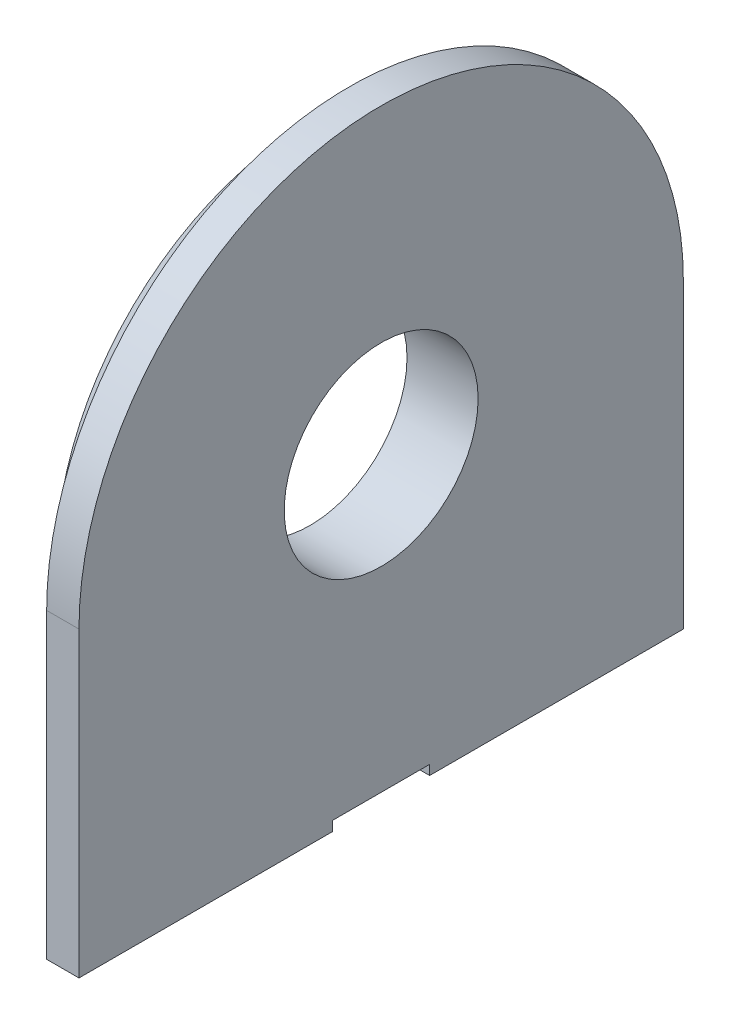
ISO-10303-21;
HEADER;
FILE_DESCRIPTION(('STEP AP214'),'2;1');
FILE_NAME('part.step','',(''),(''),'','','');
FILE_SCHEMA(('AUTOMOTIVE_DESIGN { 1 0 10303 214 1 1 1 1 }'));
ENDSEC;
DATA;
#1=APPLICATION_CONTEXT('core data for automotive mechanical design processes');
#2=APPLICATION_PROTOCOL_DEFINITION('international standard','automotive_design',2000,#1);
#3=PRODUCT_CONTEXT('',#1,'mechanical');
#4=PRODUCT('Part','Part','',(#3));
#5=PRODUCT_RELATED_PRODUCT_CATEGORY('part','',(#4));
#6=PRODUCT_DEFINITION_FORMATION('','',#4);
#7=PRODUCT_DEFINITION_CONTEXT('part definition',#1,'design');
#8=PRODUCT_DEFINITION('design','',#6,#7);
#9=PRODUCT_DEFINITION_SHAPE('','',#8);
#10=(LENGTH_UNIT() NAMED_UNIT(*) SI_UNIT(.MILLI.,.METRE.));
#11=(NAMED_UNIT(*) PLANE_ANGLE_UNIT() SI_UNIT($,.RADIAN.));
#12=(NAMED_UNIT(*) SI_UNIT($,.STERADIAN.) SOLID_ANGLE_UNIT());
#13=UNCERTAINTY_MEASURE_WITH_UNIT(LENGTH_MEASURE(1.E-05),#10,'distance_accuracy_value','');
#14=(GEOMETRIC_REPRESENTATION_CONTEXT(3) GLOBAL_UNCERTAINTY_ASSIGNED_CONTEXT((#13)) GLOBAL_UNIT_ASSIGNED_CONTEXT((#10,
#11,#12)) REPRESENTATION_CONTEXT('',''));
#15=CARTESIAN_POINT('',(0.,0.,0.));
#16=DIRECTION('',(0.,0.,1.));
#17=DIRECTION('',(1.,0.,0.));
#18=AXIS2_PLACEMENT_3D('',#15,#16,#17);
#19=CARTESIAN_POINT('',(17.3,0.,0.));
#20=DIRECTION('',(1.,0.,0.));
#21=DIRECTION('',(0.,0.,-1.));
#22=AXIS2_PLACEMENT_3D('',#19,#20,#21);
#23=CYLINDRICAL_SURFACE('',#22,8.35);
#24=DIRECTION('',(1.,0.,0.));
#25=VECTOR('',#24,1.);
#26=CARTESIAN_POINT('',(17.3,-8.24818161778704,-1.3));
#27=LINE('',#26,#25);
#28=CARTESIAN_POINT('',(17.8,-8.24818161778704,-1.3));
#29=VERTEX_POINT('',#28);
#30=CARTESIAN_POINT('',(18.5,-8.24818161778704,-1.3));
#31=VERTEX_POINT('',#30);
#32=EDGE_CURVE('E195',#29,#31,#27,.T.);
#33=ORIENTED_EDGE('',*,*,#32,.F.);
#34=CARTESIAN_POINT('',(17.8,0.,0.));
#35=DIRECTION('',(1.,0.,0.));
#36=DIRECTION('',(0.,0.,-1.));
#37=AXIS2_PLACEMENT_3D('',#34,#35,#36);
#38=CIRCLE('',#37,8.35);
#39=CARTESIAN_POINT('',(17.8,-8.24818161778704,1.30000000000001));
#40=VERTEX_POINT('',#39);
#41=EDGE_CURVE('E194',#29,#40,#38,.T.);
#42=ORIENTED_EDGE('',*,*,#41,.T.);
#43=DIRECTION('',(1.,0.,0.));
#44=VECTOR('',#43,1.);
#45=CARTESIAN_POINT('',(17.3,-8.24818161778704,1.30000000000001));
#46=LINE('',#45,#44);
#47=CARTESIAN_POINT('',(18.5,-8.24818161778704,1.30000000000001));
#48=VERTEX_POINT('',#47);
#49=EDGE_CURVE('E192',#40,#48,#46,.T.);
#50=ORIENTED_EDGE('',*,*,#49,.T.);
#51=CARTESIAN_POINT('',(18.5,0.,0.));
#52=DIRECTION('',(1.,0.,0.));
#53=DIRECTION('',(0.,0.,-1.));
#54=AXIS2_PLACEMENT_3D('',#51,#52,#53);
#55=CIRCLE('',#54,8.35);
#56=EDGE_CURVE('E180',#31,#48,#55,.T.);
#57=ORIENTED_EDGE('',*,*,#56,.F.);
#58=EDGE_LOOP('',(#33,#42,#50,#57));
#59=FACE_BOUND('',#58,.T.);
#60=ADVANCED_FACE('F42',(#59),#23,.T.);
#61=CARTESIAN_POINT('',(17.3,-8.41739270795892,-1.3));
#62=DIRECTION('',(0.,0.,-1.));
#63=DIRECTION('',(-1.,0.,0.));
#64=AXIS2_PLACEMENT_3D('',#61,#62,#63);
#65=PLANE('',#64);
#66=DIRECTION('',(0.,1.,0.));
#67=VECTOR('',#66,1.);
#68=CARTESIAN_POINT('',(18.5,-8.41739270795892,-1.3));
#69=LINE('',#68,#67);
#70=CARTESIAN_POINT('',(18.5,-9.05,-1.3));
#71=VERTEX_POINT('',#70);
#72=EDGE_CURVE('E187',#71,#31,#69,.T.);
#73=ORIENTED_EDGE('',*,*,#72,.F.);
#74=DIRECTION('',(1.,0.,0.));
#75=VECTOR('',#74,1.);
#76=CARTESIAN_POINT('',(17.3,-9.05,-1.3));
#77=LINE('',#76,#75);
#78=CARTESIAN_POINT('',(17.3,-9.05,-1.3));
#79=VERTEX_POINT('',#78);
#80=EDGE_CURVE('E198',#79,#71,#77,.T.);
#81=ORIENTED_EDGE('',*,*,#80,.F.);
#82=DIRECTION('',(0.,1.,0.));
#83=VECTOR('',#82,1.);
#84=CARTESIAN_POINT('',(17.3,-9.05,-1.3));
#85=LINE('',#84,#83);
#86=CARTESIAN_POINT('',(17.3,-7.74160836002442,-1.3));
#87=VERTEX_POINT('',#86);
#88=EDGE_CURVE('E71',#79,#87,#85,.T.);
#89=ORIENTED_EDGE('',*,*,#88,.T.);
#90=CARTESIAN_POINT('',(17.3,-7.74160836002442,-1.3));
#91=CARTESIAN_POINT('',(17.3832988536166,-7.82607126884317,-1.3));
#92=CARTESIAN_POINT('',(17.4666149471451,-7.91051716145374,-1.3));
#93=CARTESIAN_POINT('',(17.6332816138119,-8.07937491404119,-1.3));
#94=CARTESIAN_POINT('',(17.71663218695,-8.16378677401817,-1.3));
#95=CARTESIAN_POINT('',(17.8,-8.24818161778704,-1.3));
#96=B_SPLINE_CURVE_WITH_KNOTS('',3,(#90,#91,#92,#93,#94,#95),.UNSPECIFIED.,.F.,.F.,(4,2,4),(0.,
0.35588498419705,0.71176996747812),.UNSPECIFIED.);
#97=EDGE_CURVE('E11',#87,#29,#96,.T.);
#98=ORIENTED_EDGE('',*,*,#97,.T.);
#99=ORIENTED_EDGE('',*,*,#32,.T.);
#100=EDGE_LOOP('',(#73,#81,#89,#98,#99));
#101=FACE_BOUND('',#100,.T.);
#102=ADVANCED_FACE('F217',(#101),#65,.T.);
#103=CARTESIAN_POINT('',(17.3,-9.05,-1.3));
#104=DIRECTION('',(0.,-1.,0.));
#105=DIRECTION('',(0.,0.,-1.));
#106=AXIS2_PLACEMENT_3D('',#103,#104,#105);
#107=PLANE('',#106);
#108=ORIENTED_EDGE('',*,*,#80,.T.);
#109=DIRECTION('',(0.,0.,-1.));
#110=VECTOR('',#109,1.);
#111=CARTESIAN_POINT('',(18.5,-9.05,-1.5));
#112=LINE('',#111,#110);
#113=CARTESIAN_POINT('',(18.5,-9.05,-1.5));
#114=VERTEX_POINT('',#113);
#115=EDGE_CURVE('E413',#71,#114,#112,.T.);
#116=ORIENTED_EDGE('',*,*,#115,.T.);
#117=DIRECTION('',(-1.,0.,0.));
#118=VECTOR('',#117,1.);
#119=CARTESIAN_POINT('',(19.5,-9.05,-1.5));
#120=LINE('',#119,#118);
#121=CARTESIAN_POINT('',(19.5,-9.05,-1.5));
#122=VERTEX_POINT('',#121);
#123=EDGE_CURVE('E174',#122,#114,#120,.T.);
#124=ORIENTED_EDGE('',*,*,#123,.F.);
#125=DIRECTION('',(0.,0.,-1.));
#126=VECTOR('',#125,1.);
#127=CARTESIAN_POINT('',(19.5,-9.05,-1.5));
#128=LINE('',#127,#126);
#129=CARTESIAN_POINT('',(19.5,-9.05,1.5));
#130=VERTEX_POINT('',#129);
#131=EDGE_CURVE('E153',#130,#122,#128,.T.);
#132=ORIENTED_EDGE('',*,*,#131,.F.);
#133=DIRECTION('',(-1.,0.,0.));
#134=VECTOR('',#133,1.);
#135=CARTESIAN_POINT('',(19.5,-9.05,1.5));
#136=LINE('',#135,#134);
#137=CARTESIAN_POINT('',(18.5,-9.05,1.5));
#138=VERTEX_POINT('',#137);
#139=EDGE_CURVE('E150',#130,#138,#136,.T.);
#140=ORIENTED_EDGE('',*,*,#139,.T.);
#141=CARTESIAN_POINT('',(18.5,-9.05,1.3));
#142=VERTEX_POINT('',#141);
#143=EDGE_CURVE('E417',#138,#142,#112,.T.);
#144=ORIENTED_EDGE('',*,*,#143,.T.);
#145=DIRECTION('',(1.,0.,0.));
#146=VECTOR('',#145,1.);
#147=CARTESIAN_POINT('',(17.3,-9.05,1.3));
#148=LINE('',#147,#146);
#149=CARTESIAN_POINT('',(17.3,-9.05,1.3));
#150=VERTEX_POINT('',#149);
#151=EDGE_CURVE('E184',#150,#142,#148,.T.);
#152=ORIENTED_EDGE('',*,*,#151,.F.);
#153=DIRECTION('',(0.,0.,-1.));
#154=VECTOR('',#153,1.);
#155=CARTESIAN_POINT('',(17.3,-9.05,-1.3));
#156=LINE('',#155,#154);
#157=EDGE_CURVE('E179',#150,#79,#156,.T.);
#158=ORIENTED_EDGE('',*,*,#157,.T.);
#159=EDGE_LOOP('',(#108,#116,#124,#132,#140,#144,#152,#158));
#160=FACE_BOUND('',#159,.T.);
#161=ADVANCED_FACE('F214',(#160),#107,.T.);
#162=CARTESIAN_POINT('',(17.3,-8.41739270795892,1.3));
#163=DIRECTION('',(0.,0.,1.));
#164=DIRECTION('',(1.,0.,0.));
#165=AXIS2_PLACEMENT_3D('',#162,#163,#164);
#166=PLANE('',#165);
#167=DIRECTION('',(0.,-1.,0.));
#168=VECTOR('',#167,1.);
#169=CARTESIAN_POINT('',(18.5,-8.41739270795892,1.3));
#170=LINE('',#169,#168);
#171=EDGE_CURVE('E172',#48,#142,#170,.T.);
#172=ORIENTED_EDGE('',*,*,#171,.F.);
#173=ORIENTED_EDGE('',*,*,#49,.F.);
#174=CARTESIAN_POINT('',(17.8,-8.24818161778704,1.30000000000001));
#175=CARTESIAN_POINT('',(17.71663218695,-8.16378677401817,1.3));
#176=CARTESIAN_POINT('',(17.6332816138119,-8.07937491404119,1.3));
#177=CARTESIAN_POINT('',(17.4666149471451,-7.91051716145374,1.3));
#178=CARTESIAN_POINT('',(17.3832988536166,-7.82607126884317,1.3));
#179=CARTESIAN_POINT('',(17.3,-7.74160836002442,1.3));
#180=B_SPLINE_CURVE_WITH_KNOTS('',3,(#174,#175,#176,#177,#178,#179),.UNSPECIFIED.,.F.,.F.,(4,2,
4),(0.,0.355884983281069,0.71176996747812),.UNSPECIFIED.);
#181=CARTESIAN_POINT('',(17.3,-7.74160836002442,1.3));
#182=VERTEX_POINT('',#181);
#183=EDGE_CURVE('E57',#40,#182,#180,.T.);
#184=ORIENTED_EDGE('',*,*,#183,.T.);
#185=DIRECTION('',(0.,-1.,0.));
#186=VECTOR('',#185,1.);
#187=CARTESIAN_POINT('',(17.3,-8.41739270795892,1.3));
#188=LINE('',#187,#186);
#189=EDGE_CURVE('E64',#182,#150,#188,.T.);
#190=ORIENTED_EDGE('',*,*,#189,.T.);
#191=ORIENTED_EDGE('',*,*,#151,.T.);
#192=EDGE_LOOP('',(#172,#173,#184,#190,#191));
#193=FACE_BOUND('',#192,.T.);
#194=ADVANCED_FACE('F209',(#193),#166,.T.);
#195=CARTESIAN_POINT('',(17.3,0.,0.));
#196=DIRECTION('',(1.,0.,0.));
#197=DIRECTION('',(0.,0.,-1.));
#198=AXIS2_PLACEMENT_3D('',#195,#196,#197);
#199=PLANE('',#198);
#200=CARTESIAN_POINT('',(17.3,0.,0.));
#201=DIRECTION('',(1.,0.,0.));
#202=DIRECTION('',(0.,0.,-1.));
#203=AXIS2_PLACEMENT_3D('',#200,#201,#202);
#204=CIRCLE('',#203,3.);
#205=CARTESIAN_POINT('',(17.3,0.,-3.));
#206=VERTEX_POINT('',#205);
#207=EDGE_CURVE('E169',#206,#206,#204,.T.);
#208=ORIENTED_EDGE('',*,*,#207,.T.);
#209=EDGE_LOOP('',(#208));
#210=FACE_BOUND('',#209,.T.);
#211=ORIENTED_EDGE('',*,*,#189,.F.);
#212=CARTESIAN_POINT('',(17.3,0.,0.));
#213=DIRECTION('',(1.,0.,0.));
#214=DIRECTION('',(0.,0.,-1.));
#215=AXIS2_PLACEMENT_3D('',#212,#213,#214);
#216=CIRCLE('',#215,7.85);
#217=EDGE_CURVE('E204',#182,#87,#216,.F.);
#218=ORIENTED_EDGE('',*,*,#217,.T.);
#219=ORIENTED_EDGE('',*,*,#88,.F.);
#220=ORIENTED_EDGE('',*,*,#157,.F.);
#221=EDGE_LOOP('',(#211,#218,#219,#220));
#222=FACE_BOUND('',#221,.T.);
#223=ADVANCED_FACE('F213',(#210,#222),#199,.F.);
#224=CARTESIAN_POINT('',(17.3,0.,0.));
#225=DIRECTION('',(1.,0.,0.));
#226=DIRECTION('',(0.,0.,-1.));
#227=AXIS2_PLACEMENT_3D('',#224,#225,#226);
#228=CYLINDRICAL_SURFACE('',#227,3.);
#229=ORIENTED_EDGE('',*,*,#207,.F.);
#230=EDGE_LOOP('',(#229));
#231=FACE_BOUND('',#230,.T.);
#232=CARTESIAN_POINT('',(19.5,0.,0.));
#233=DIRECTION('',(1.,0.,0.));
#234=DIRECTION('',(0.,0.,-1.));
#235=AXIS2_PLACEMENT_3D('',#232,#233,#234);
#236=CIRCLE('',#235,3.);
#237=CARTESIAN_POINT('',(19.5,0.,-3.));
#238=VERTEX_POINT('',#237);
#239=EDGE_CURVE('E464',#238,#238,#236,.T.);
#240=ORIENTED_EDGE('',*,*,#239,.T.);
#241=EDGE_LOOP('',(#240));
#242=FACE_BOUND('',#241,.T.);
#243=ADVANCED_FACE('F227',(#231,#242),#228,.F.);
#244=CARTESIAN_POINT('',(17.8,0.,0.));
#245=DIRECTION('',(1.,0.,0.));
#246=DIRECTION('',(0.,0.,-1.));
#247=AXIS2_PLACEMENT_3D('',#244,#245,#246);
#248=CONICAL_SURFACE('',#247,8.35,0.785398163397455);
#249=ORIENTED_EDGE('',*,*,#97,.F.);
#250=ORIENTED_EDGE('',*,*,#217,.F.);
#251=ORIENTED_EDGE('',*,*,#183,.F.);
#252=ORIENTED_EDGE('',*,*,#41,.F.);
#253=EDGE_LOOP('',(#249,#250,#251,#252));
#254=FACE_BOUND('',#253,.T.);
#255=ADVANCED_FACE('F45',(#254),#248,.T.);
#256=CARTESIAN_POINT('',(18.5,0.,0.));
#257=DIRECTION('',(1.,0.,0.));
#258=DIRECTION('',(0.,0.,-1.));
#259=AXIS2_PLACEMENT_3D('',#256,#257,#258);
#260=PLANE('',#259);
#261=ORIENTED_EDGE('',*,*,#56,.T.);
#262=ORIENTED_EDGE('',*,*,#171,.T.);
#263=ORIENTED_EDGE('',*,*,#143,.F.);
#264=DIRECTION('',(0.,1.,0.));
#265=VECTOR('',#264,1.);
#266=CARTESIAN_POINT('',(18.5,-9.35,1.5));
#267=LINE('',#266,#265);
#268=CARTESIAN_POINT('',(18.5,-9.35,1.5));
#269=VERTEX_POINT('',#268);
#270=EDGE_CURVE('E422',#269,#138,#267,.T.);
#271=ORIENTED_EDGE('',*,*,#270,.F.);
#272=DIRECTION('',(0.,0.,-1.));
#273=VECTOR('',#272,1.);
#274=CARTESIAN_POINT('',(18.5,-9.35,9.35));
#275=LINE('',#274,#273);
#276=CARTESIAN_POINT('',(18.5,-9.35,9.35));
#277=VERTEX_POINT('',#276);
#278=EDGE_CURVE('E168',#277,#269,#275,.T.);
#279=ORIENTED_EDGE('',*,*,#278,.F.);
#280=DIRECTION('',(0.,-1.,0.));
#281=VECTOR('',#280,1.);
#282=CARTESIAN_POINT('',(18.5,0.,9.35));
#283=LINE('',#282,#281);
#284=CARTESIAN_POINT('',(18.5,0.,9.35));
#285=VERTEX_POINT('',#284);
#286=EDGE_CURVE('E164',#285,#277,#283,.T.);
#287=ORIENTED_EDGE('',*,*,#286,.F.);
#288=CARTESIAN_POINT('',(18.5,0.,0.));
#289=DIRECTION('',(1.,0.,0.));
#290=DIRECTION('',(0.,0.,-1.));
#291=AXIS2_PLACEMENT_3D('',#288,#289,#290);
#292=CIRCLE('',#291,9.35);
#293=CARTESIAN_POINT('',(18.5,0.,-9.35));
#294=VERTEX_POINT('',#293);
#295=EDGE_CURVE('E429',#294,#285,#292,.T.);
#296=ORIENTED_EDGE('',*,*,#295,.F.);
#297=DIRECTION('',(0.,1.,0.));
#298=VECTOR('',#297,1.);
#299=CARTESIAN_POINT('',(18.5,-9.35,-9.35000000000006));
#300=LINE('',#299,#298);
#301=CARTESIAN_POINT('',(18.5,-9.35,-9.35000000000006));
#302=VERTEX_POINT('',#301);
#303=EDGE_CURVE('E427',#302,#294,#300,.T.);
#304=ORIENTED_EDGE('',*,*,#303,.F.);
#305=DIRECTION('',(0.,0.,-1.));
#306=VECTOR('',#305,1.);
#307=CARTESIAN_POINT('',(18.5,-9.35,-1.5));
#308=LINE('',#307,#306);
#309=CARTESIAN_POINT('',(18.5,-9.35,-1.5));
#310=VERTEX_POINT('',#309);
#311=EDGE_CURVE('E420',#310,#302,#308,.T.);
#312=ORIENTED_EDGE('',*,*,#311,.F.);
#313=DIRECTION('',(0.,-1.,0.));
#314=VECTOR('',#313,1.);
#315=CARTESIAN_POINT('',(18.5,-9.05,-1.5));
#316=LINE('',#315,#314);
#317=EDGE_CURVE('E418',#114,#310,#316,.T.);
#318=ORIENTED_EDGE('',*,*,#317,.F.);
#319=ORIENTED_EDGE('',*,*,#115,.F.);
#320=ORIENTED_EDGE('',*,*,#72,.T.);
#321=EDGE_LOOP('',(#261,#262,#263,#271,#279,#287,#296,#304,#312,#318,#319,#320));
#322=FACE_BOUND('',#321,.T.);
#323=ADVANCED_FACE('F256',(#322),#260,.F.);
#324=CARTESIAN_POINT('',(19.5,0.,0.));
#325=DIRECTION('',(1.,0.,0.));
#326=DIRECTION('',(0.,0.,-1.));
#327=AXIS2_PLACEMENT_3D('',#324,#325,#326);
#328=PLANE('',#327);
#329=DIRECTION('',(0.,0.,-1.));
#330=VECTOR('',#329,1.);
#331=CARTESIAN_POINT('',(19.5,-9.35,9.35));
#332=LINE('',#331,#330);
#333=CARTESIAN_POINT('',(19.5,-9.35,9.35));
#334=VERTEX_POINT('',#333);
#335=CARTESIAN_POINT('',(19.5,-9.35,1.5));
#336=VERTEX_POINT('',#335);
#337=EDGE_CURVE('E154',#334,#336,#332,.T.);
#338=ORIENTED_EDGE('',*,*,#337,.T.);
#339=DIRECTION('',(0.,1.,0.));
#340=VECTOR('',#339,1.);
#341=CARTESIAN_POINT('',(19.5,-9.35,1.5));
#342=LINE('',#341,#340);
#343=EDGE_CURVE('E143',#336,#130,#342,.T.);
#344=ORIENTED_EDGE('',*,*,#343,.T.);
#345=ORIENTED_EDGE('',*,*,#131,.T.);
#346=DIRECTION('',(0.,-1.,0.));
#347=VECTOR('',#346,1.);
#348=CARTESIAN_POINT('',(19.5,-9.05,-1.5));
#349=LINE('',#348,#347);
#350=CARTESIAN_POINT('',(19.5,-9.35,-1.5));
#351=VERTEX_POINT('',#350);
#352=EDGE_CURVE('E447',#122,#351,#349,.T.);
#353=ORIENTED_EDGE('',*,*,#352,.T.);
#354=DIRECTION('',(0.,0.,-1.));
#355=VECTOR('',#354,1.);
#356=CARTESIAN_POINT('',(19.5,-9.35,-1.5));
#357=LINE('',#356,#355);
#358=CARTESIAN_POINT('',(19.5,-9.35,-9.35000000000006));
#359=VERTEX_POINT('',#358);
#360=EDGE_CURVE('E458',#351,#359,#357,.T.);
#361=ORIENTED_EDGE('',*,*,#360,.T.);
#362=DIRECTION('',(0.,1.,0.));
#363=VECTOR('',#362,1.);
#364=CARTESIAN_POINT('',(19.5,-9.35,-9.35000000000006));
#365=LINE('',#364,#363);
#366=CARTESIAN_POINT('',(19.5,0.,-9.35));
#367=VERTEX_POINT('',#366);
#368=EDGE_CURVE('E455',#359,#367,#365,.T.);
#369=ORIENTED_EDGE('',*,*,#368,.T.);
#370=CARTESIAN_POINT('',(19.5,0.,0.));
#371=DIRECTION('',(1.,0.,0.));
#372=DIRECTION('',(0.,0.,-1.));
#373=AXIS2_PLACEMENT_3D('',#370,#371,#372);
#374=CIRCLE('',#373,9.35);
#375=CARTESIAN_POINT('',(19.5,0.,9.35));
#376=VERTEX_POINT('',#375);
#377=EDGE_CURVE('E457',#367,#376,#374,.T.);
#378=ORIENTED_EDGE('',*,*,#377,.T.);
#379=DIRECTION('',(0.,-1.,0.));
#380=VECTOR('',#379,1.);
#381=CARTESIAN_POINT('',(19.5,0.,9.35));
#382=LINE('',#381,#380);
#383=EDGE_CURVE('E160',#376,#334,#382,.T.);
#384=ORIENTED_EDGE('',*,*,#383,.T.);
#385=EDGE_LOOP('',(#338,#344,#345,#353,#361,#369,#378,#384));
#386=FACE_BOUND('',#385,.T.);
#387=ORIENTED_EDGE('',*,*,#239,.F.);
#388=EDGE_LOOP('',(#387));
#389=FACE_BOUND('',#388,.T.);
#390=ADVANCED_FACE('F157',(#386,#389),#328,.T.);
#391=CARTESIAN_POINT('',(19.5,-9.35,9.35));
#392=DIRECTION('',(0.,1.,0.));
#393=DIRECTION('',(0.,0.,1.));
#394=AXIS2_PLACEMENT_3D('',#391,#392,#393);
#395=PLANE('',#394);
#396=ORIENTED_EDGE('',*,*,#278,.T.);
#397=DIRECTION('',(-1.,0.,0.));
#398=VECTOR('',#397,1.);
#399=CARTESIAN_POINT('',(19.5,-9.35,1.5));
#400=LINE('',#399,#398);
#401=EDGE_CURVE('E147',#336,#269,#400,.T.);
#402=ORIENTED_EDGE('',*,*,#401,.F.);
#403=ORIENTED_EDGE('',*,*,#337,.F.);
#404=DIRECTION('',(-1.,0.,0.));
#405=VECTOR('',#404,1.);
#406=CARTESIAN_POINT('',(19.5,-9.35,9.35));
#407=LINE('',#406,#405);
#408=EDGE_CURVE('E432',#334,#277,#407,.T.);
#409=ORIENTED_EDGE('',*,*,#408,.T.);
#410=EDGE_LOOP('',(#396,#402,#403,#409));
#411=FACE_BOUND('',#410,.T.);
#412=ADVANCED_FACE('F166',(#411),#395,.F.);
#413=CARTESIAN_POINT('',(19.5,-9.35,1.5));
#414=DIRECTION('',(0.,0.,1.));
#415=DIRECTION('',(0.,-1.,0.));
#416=AXIS2_PLACEMENT_3D('',#413,#414,#415);
#417=PLANE('',#416);
#418=ORIENTED_EDGE('',*,*,#270,.T.);
#419=ORIENTED_EDGE('',*,*,#139,.F.);
#420=ORIENTED_EDGE('',*,*,#343,.F.);
#421=ORIENTED_EDGE('',*,*,#401,.T.);
#422=EDGE_LOOP('',(#418,#419,#420,#421));
#423=FACE_BOUND('',#422,.T.);
#424=ADVANCED_FACE('F145',(#423),#417,.F.);
#425=CARTESIAN_POINT('',(19.5,-9.05,-1.5));
#426=DIRECTION('',(0.,0.,-1.));
#427=DIRECTION('',(0.,1.,0.));
#428=AXIS2_PLACEMENT_3D('',#425,#426,#427);
#429=PLANE('',#428);
#430=ORIENTED_EDGE('',*,*,#317,.T.);
#431=DIRECTION('',(-1.,0.,0.));
#432=VECTOR('',#431,1.);
#433=CARTESIAN_POINT('',(19.5,-9.35,-1.5));
#434=LINE('',#433,#432);
#435=EDGE_CURVE('E443',#351,#310,#434,.T.);
#436=ORIENTED_EDGE('',*,*,#435,.F.);
#437=ORIENTED_EDGE('',*,*,#352,.F.);
#438=ORIENTED_EDGE('',*,*,#123,.T.);
#439=EDGE_LOOP('',(#430,#436,#437,#438));
#440=FACE_BOUND('',#439,.T.);
#441=ADVANCED_FACE('F236',(#440),#429,.F.);
#442=CARTESIAN_POINT('',(19.5,-9.35,-1.5));
#443=DIRECTION('',(0.,1.,0.));
#444=DIRECTION('',(0.,0.,1.));
#445=AXIS2_PLACEMENT_3D('',#442,#443,#444);
#446=PLANE('',#445);
#447=ORIENTED_EDGE('',*,*,#311,.T.);
#448=DIRECTION('',(-1.,0.,0.));
#449=VECTOR('',#448,1.);
#450=CARTESIAN_POINT('',(19.5,-9.35,-9.35000000000006));
#451=LINE('',#450,#449);
#452=EDGE_CURVE('E440',#359,#302,#451,.T.);
#453=ORIENTED_EDGE('',*,*,#452,.F.);
#454=ORIENTED_EDGE('',*,*,#360,.F.);
#455=ORIENTED_EDGE('',*,*,#435,.T.);
#456=EDGE_LOOP('',(#447,#453,#454,#455));
#457=FACE_BOUND('',#456,.T.);
#458=ADVANCED_FACE('F239',(#457),#446,.F.);
#459=CARTESIAN_POINT('',(19.5,-9.35,-9.35000000000006));
#460=DIRECTION('',(0.,0.,1.));
#461=DIRECTION('',(0.,-1.,0.));
#462=AXIS2_PLACEMENT_3D('',#459,#460,#461);
#463=PLANE('',#462);
#464=ORIENTED_EDGE('',*,*,#303,.T.);
#465=DIRECTION('',(-1.,0.,0.));
#466=VECTOR('',#465,1.);
#467=CARTESIAN_POINT('',(19.5,0.,-9.35));
#468=LINE('',#467,#466);
#469=EDGE_CURVE('E437',#367,#294,#468,.T.);
#470=ORIENTED_EDGE('',*,*,#469,.F.);
#471=ORIENTED_EDGE('',*,*,#368,.F.);
#472=ORIENTED_EDGE('',*,*,#452,.T.);
#473=EDGE_LOOP('',(#464,#470,#471,#472));
#474=FACE_BOUND('',#473,.T.);
#475=ADVANCED_FACE('F243',(#474),#463,.F.);
#476=CARTESIAN_POINT('',(19.5,0.,0.));
#477=DIRECTION('',(-1.,0.,0.));
#478=DIRECTION('',(0.,0.,1.));
#479=AXIS2_PLACEMENT_3D('',#476,#477,#478);
#480=CYLINDRICAL_SURFACE('',#479,9.35);
#481=ORIENTED_EDGE('',*,*,#295,.T.);
#482=DIRECTION('',(-1.,0.,0.));
#483=VECTOR('',#482,1.);
#484=CARTESIAN_POINT('',(19.5,0.,9.35));
#485=LINE('',#484,#483);
#486=EDGE_CURVE('E434',#376,#285,#485,.T.);
#487=ORIENTED_EDGE('',*,*,#486,.F.);
#488=ORIENTED_EDGE('',*,*,#377,.F.);
#489=ORIENTED_EDGE('',*,*,#469,.T.);
#490=EDGE_LOOP('',(#481,#487,#488,#489));
#491=FACE_BOUND('',#490,.T.);
#492=ADVANCED_FACE('F247',(#491),#480,.T.);
#493=CARTESIAN_POINT('',(19.5,0.,9.35));
#494=DIRECTION('',(0.,0.,-1.));
#495=DIRECTION('',(-1.,0.,0.));
#496=AXIS2_PLACEMENT_3D('',#493,#494,#495);
#497=PLANE('',#496);
#498=ORIENTED_EDGE('',*,*,#286,.T.);
#499=ORIENTED_EDGE('',*,*,#408,.F.);
#500=ORIENTED_EDGE('',*,*,#383,.F.);
#501=ORIENTED_EDGE('',*,*,#486,.T.);
#502=EDGE_LOOP('',(#498,#499,#500,#501));
#503=FACE_BOUND('',#502,.T.);
#504=ADVANCED_FACE('F251',(#503),#497,.F.);
#505=CLOSED_SHELL('',(#60,#102,#161,#194,#223,#243,#255,#323,#390,#412,#424,#441,#458,#475,#492,#504));
#506=MANIFOLD_SOLID_BREP('B2',#505);
#507=ADVANCED_BREP_SHAPE_REPRESENTATION('',(#18,#506),#14);
#508=SHAPE_DEFINITION_REPRESENTATION(#9,#507);
ENDSEC;
END-ISO-10303-21;
